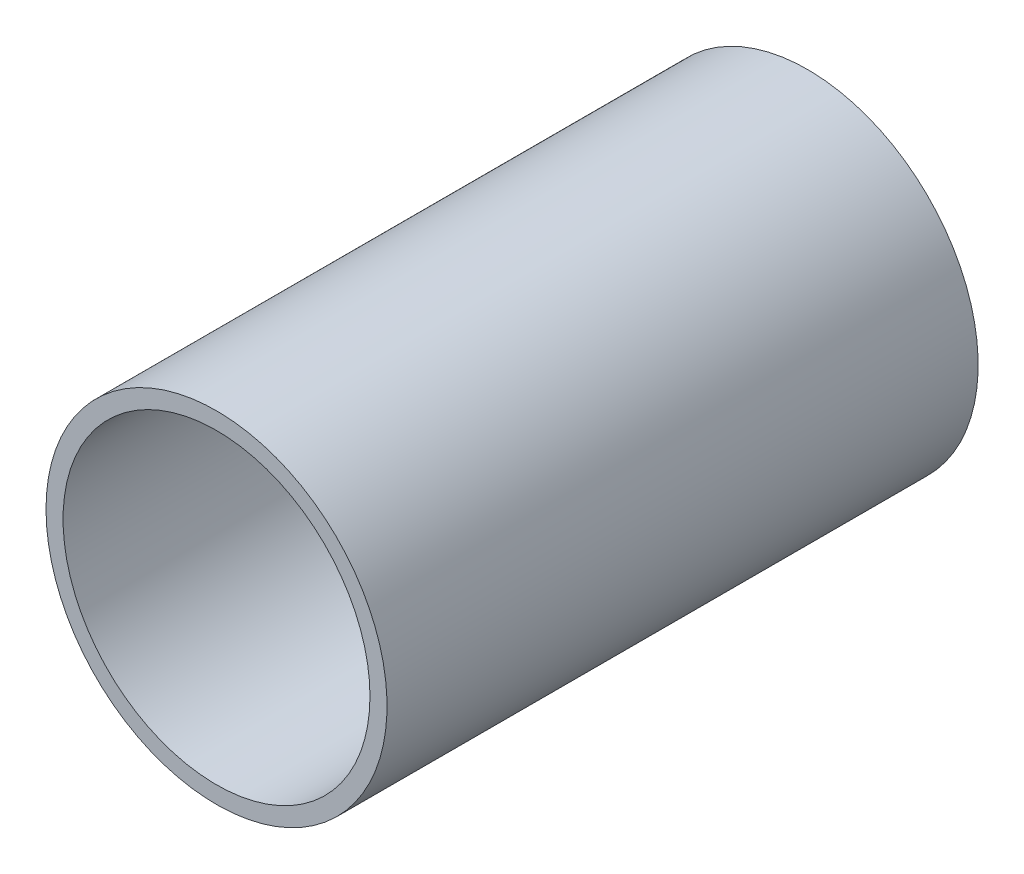
ISO-10303-21;
HEADER;
FILE_DESCRIPTION(('STEP AP214'),'2;1');
FILE_NAME('part.step','',(''),(''),'','','');
FILE_SCHEMA(('AUTOMOTIVE_DESIGN { 1 0 10303 214 1 1 1 1 }'));
ENDSEC;
DATA;
#1=APPLICATION_CONTEXT('core data for automotive mechanical design processes');
#2=APPLICATION_PROTOCOL_DEFINITION('international standard','automotive_design',2000,#1);
#3=PRODUCT_CONTEXT('',#1,'mechanical');
#4=PRODUCT('Part','Part','',(#3));
#5=PRODUCT_RELATED_PRODUCT_CATEGORY('part','',(#4));
#6=PRODUCT_DEFINITION_FORMATION('','',#4);
#7=PRODUCT_DEFINITION_CONTEXT('part definition',#1,'design');
#8=PRODUCT_DEFINITION('design','',#6,#7);
#9=PRODUCT_DEFINITION_SHAPE('','',#8);
#10=(LENGTH_UNIT() NAMED_UNIT(*) SI_UNIT(.MILLI.,.METRE.));
#11=(NAMED_UNIT(*) PLANE_ANGLE_UNIT() SI_UNIT($,.RADIAN.));
#12=(NAMED_UNIT(*) SI_UNIT($,.STERADIAN.) SOLID_ANGLE_UNIT());
#13=UNCERTAINTY_MEASURE_WITH_UNIT(LENGTH_MEASURE(1.E-05),#10,'distance_accuracy_value','');
#14=(GEOMETRIC_REPRESENTATION_CONTEXT(3) GLOBAL_UNCERTAINTY_ASSIGNED_CONTEXT((#13)) GLOBAL_UNIT_ASSIGNED_CONTEXT((#10,
#11,#12)) REPRESENTATION_CONTEXT('',''));
#15=CARTESIAN_POINT('',(0.,0.,0.));
#16=DIRECTION('',(0.,0.,1.));
#17=DIRECTION('',(1.,0.,0.));
#18=AXIS2_PLACEMENT_3D('',#15,#16,#17);
#19=CARTESIAN_POINT('',(0.,0.,52.));
#20=DIRECTION('',(0.,0.,-1.));
#21=DIRECTION('',(-1.,0.,0.));
#22=AXIS2_PLACEMENT_3D('',#19,#20,#21);
#23=CYLINDRICAL_SURFACE('',#22,15.);
#24=CARTESIAN_POINT('',(0.,0.,52.));
#25=DIRECTION('',(0.,0.,1.));
#26=DIRECTION('',(1.,0.,0.));
#27=AXIS2_PLACEMENT_3D('',#24,#25,#26);
#28=CIRCLE('',#27,15.);
#29=CARTESIAN_POINT('',(-15.,0.,52.));
#30=VERTEX_POINT('',#29);
#31=EDGE_CURVE('E10',#30,#30,#28,.T.);
#32=CARTESIAN_POINT('',(0.,0.,0.));
#33=DIRECTION('',(0.,0.,1.));
#34=DIRECTION('',(1.,0.,0.));
#35=AXIS2_PLACEMENT_3D('',#32,#33,#34);
#36=CIRCLE('',#35,15.);
#37=CARTESIAN_POINT('',(-15.,0.,0.));
#38=VERTEX_POINT('',#37);
#39=EDGE_CURVE('E33',#38,#38,#36,.T.);
#40=CARTESIAN_POINT('',(-15.,0.,52.));
#41=CARTESIAN_POINT('',(-15.,0.,51.4583333333333));
#42=CARTESIAN_POINT('',(-15.,0.,50.9166666666667));
#43=CARTESIAN_POINT('',(-15.,0.,49.8333333333333));
#44=CARTESIAN_POINT('',(-15.,0.,49.2916666666667));
#45=CARTESIAN_POINT('',(-15.,0.,48.2083333333333));
#46=CARTESIAN_POINT('',(-15.,0.,47.6666666666667));
#47=CARTESIAN_POINT('',(-15.,0.,46.5833333333333));
#48=CARTESIAN_POINT('',(-15.,0.,46.0416666666667));
#49=CARTESIAN_POINT('',(-15.,0.,44.9583333333333));
#50=CARTESIAN_POINT('',(-15.,0.,44.4166666666667));
#51=CARTESIAN_POINT('',(-15.,0.,43.3333333333333));
#52=CARTESIAN_POINT('',(-15.,0.,42.7916666666667));
#53=CARTESIAN_POINT('',(-15.,0.,41.7083333333333));
#54=CARTESIAN_POINT('',(-15.,0.,41.1666666666667));
#55=CARTESIAN_POINT('',(-15.,0.,40.0833333333333));
#56=CARTESIAN_POINT('',(-15.,0.,39.5416666666667));
#57=CARTESIAN_POINT('',(-15.,0.,38.4583333333333));
#58=CARTESIAN_POINT('',(-15.,0.,37.9166666666667));
#59=CARTESIAN_POINT('',(-15.,0.,36.8333333333333));
#60=CARTESIAN_POINT('',(-15.,0.,36.2916666666667));
#61=CARTESIAN_POINT('',(-15.,0.,35.2083333333333));
#62=CARTESIAN_POINT('',(-15.,0.,34.6666666666667));
#63=CARTESIAN_POINT('',(-15.,0.,33.5833333333333));
#64=CARTESIAN_POINT('',(-15.,0.,33.0416666666667));
#65=CARTESIAN_POINT('',(-15.,0.,31.9583333333333));
#66=CARTESIAN_POINT('',(-15.,0.,31.4166666666667));
#67=CARTESIAN_POINT('',(-15.,0.,30.3333333333333));
#68=CARTESIAN_POINT('',(-15.,0.,29.7916666666667));
#69=CARTESIAN_POINT('',(-15.,0.,28.7083333333333));
#70=CARTESIAN_POINT('',(-15.,0.,28.1666666666667));
#71=CARTESIAN_POINT('',(-15.,0.,27.0833333333333));
#72=CARTESIAN_POINT('',(-15.,0.,26.5416666666667));
#73=CARTESIAN_POINT('',(-15.,0.,25.4583333333333));
#74=CARTESIAN_POINT('',(-15.,0.,24.9166666666667));
#75=CARTESIAN_POINT('',(-15.,0.,23.8333333333333));
#76=CARTESIAN_POINT('',(-15.,0.,23.2916666666667));
#77=CARTESIAN_POINT('',(-15.,0.,22.2083333333333));
#78=CARTESIAN_POINT('',(-15.,0.,21.6666666666667));
#79=CARTESIAN_POINT('',(-15.,0.,20.5833333333333));
#80=CARTESIAN_POINT('',(-15.,0.,20.0416666666667));
#81=CARTESIAN_POINT('',(-15.,0.,18.9583333333333));
#82=CARTESIAN_POINT('',(-15.,0.,18.4166666666667));
#83=CARTESIAN_POINT('',(-15.,0.,17.3333333333333));
#84=CARTESIAN_POINT('',(-15.,0.,16.7916666666667));
#85=CARTESIAN_POINT('',(-15.,0.,15.7083333333333));
#86=CARTESIAN_POINT('',(-15.,0.,15.1666666666667));
#87=CARTESIAN_POINT('',(-15.,0.,14.0833333333333));
#88=CARTESIAN_POINT('',(-15.,0.,13.5416666666667));
#89=CARTESIAN_POINT('',(-15.,0.,12.4583333333333));
#90=CARTESIAN_POINT('',(-15.,0.,11.9166666666667));
#91=CARTESIAN_POINT('',(-15.,0.,10.8333333333333));
#92=CARTESIAN_POINT('',(-15.,0.,10.2916666666667));
#93=CARTESIAN_POINT('',(-15.,0.,9.20833333333333));
#94=CARTESIAN_POINT('',(-15.,0.,8.66666666666667));
#95=CARTESIAN_POINT('',(-15.,0.,7.58333333333333));
#96=CARTESIAN_POINT('',(-15.,0.,7.04166666666667));
#97=CARTESIAN_POINT('',(-15.,0.,5.95833333333333));
#98=CARTESIAN_POINT('',(-15.,0.,5.41666666666667));
#99=CARTESIAN_POINT('',(-15.,0.,4.33333333333333));
#100=CARTESIAN_POINT('',(-15.,0.,3.79166666666667));
#101=CARTESIAN_POINT('',(-15.,0.,2.70833333333334));
#102=CARTESIAN_POINT('',(-15.,0.,2.16666666666667));
#103=CARTESIAN_POINT('',(-15.,0.,1.08333333333333));
#104=CARTESIAN_POINT('',(-15.,0.,0.541666666666667));
#105=CARTESIAN_POINT('',(-15.,0.,0.));
#106=B_SPLINE_CURVE_WITH_KNOTS('',3,(#40,#41,#42,#43,#44,#45,#46,#47,#48,#49,#50,#51,#52,#53,
#54,#55,#56,#57,#58,#59,#60,#61,#62,#63,#64,#65,#66,#67,#68,#69,#70,#71,#72,#73,#74,#75,#76,#77,
#78,#79,#80,#81,#82,#83,#84,#85,#86,#87,#88,#89,#90,#91,#92,#93,#94,#95,#96,#97,#98,#99,#100,
#101,#102,#103,#104,#105),.UNSPECIFIED.,.F.,.F.,(4,2,2,2,2,2,2,2,2,2,2,2,2,2,2,2,2,2,2,2,2,2,2,
2,2,2,2,2,2,2,2,2,4),(0.,1.62499999999999,3.25,4.875,6.49999999999999,8.12499999999999,
9.74999999999999,11.375,13.,14.625,16.25,17.875,19.5,21.125,22.75,24.375,26.,27.625,29.25,
30.875,32.5,34.125,35.75,37.375,39.,40.625,42.25,43.875,45.5,47.125,48.75,50.375,52.),.UNSPECIFIED.);
#107=EDGE_CURVE('BSEAM30',#30,#38,#106,.T.);
#108=ORIENTED_EDGE('',*,*,#31,.F.);
#109=ORIENTED_EDGE('',*,*,#39,.T.);
#110=ORIENTED_EDGE('',*,*,#107,.T.);
#111=ORIENTED_EDGE('',*,*,#107,.F.);
#112=EDGE_LOOP('',(#108,#110,#109,#111));
#113=FACE_BOUND('',#112,.T.);
#114=ADVANCED_FACE('F30',(#113),#23,.T.);
#115=CARTESIAN_POINT('',(0.,0.,52.));
#116=DIRECTION('',(0.,0.,1.));
#117=DIRECTION('',(1.,0.,0.));
#118=AXIS2_PLACEMENT_3D('',#115,#116,#117);
#119=PLANE('',#118);
#120=CARTESIAN_POINT('',(0.,0.,52.));
#121=DIRECTION('',(0.,0.,1.));
#122=DIRECTION('',(1.,0.,0.));
#123=AXIS2_PLACEMENT_3D('',#120,#121,#122);
#124=CIRCLE('',#123,13.5);
#125=CARTESIAN_POINT('',(13.5,0.,52.));
#126=VERTEX_POINT('',#125);
#127=EDGE_CURVE('E42',#126,#126,#124,.T.);
#128=ORIENTED_EDGE('',*,*,#127,.F.);
#129=EDGE_LOOP('',(#128));
#130=FACE_BOUND('',#129,.T.);
#131=ORIENTED_EDGE('',*,*,#31,.T.);
#132=EDGE_LOOP('',(#131));
#133=FACE_BOUND('',#132,.T.);
#134=ADVANCED_FACE('F57',(#130,#133),#119,.T.);
#135=CARTESIAN_POINT('',(0.,0.,0.));
#136=DIRECTION('',(0.,0.,1.));
#137=DIRECTION('',(1.,0.,0.));
#138=AXIS2_PLACEMENT_3D('',#135,#136,#137);
#139=PLANE('',#138);
#140=ORIENTED_EDGE('',*,*,#39,.F.);
#141=EDGE_LOOP('',(#140));
#142=FACE_BOUND('',#141,.T.);
#143=ADVANCED_FACE('F53',(#142),#139,.F.);
#144=CARTESIAN_POINT('',(0.,0.,4.));
#145=DIRECTION('',(0.,0.,1.));
#146=DIRECTION('',(1.,0.,0.));
#147=AXIS2_PLACEMENT_3D('',#144,#145,#146);
#148=CYLINDRICAL_SURFACE('',#147,13.5);
#149=CARTESIAN_POINT('',(0.,0.,4.));
#150=DIRECTION('',(0.,0.,1.));
#151=DIRECTION('',(1.,0.,0.));
#152=AXIS2_PLACEMENT_3D('',#149,#150,#151);
#153=CIRCLE('',#152,13.5);
#154=CARTESIAN_POINT('',(13.5,0.,4.));
#155=VERTEX_POINT('',#154);
#156=EDGE_CURVE('E40',#155,#155,#153,.T.);
#157=ORIENTED_EDGE('',*,*,#156,.F.);
#158=EDGE_LOOP('',(#157));
#159=FACE_BOUND('',#158,.T.);
#160=ORIENTED_EDGE('',*,*,#127,.T.);
#161=EDGE_LOOP('',(#160));
#162=FACE_BOUND('',#161,.T.);
#163=ADVANCED_FACE('F50',(#159,#162),#148,.F.);
#164=CARTESIAN_POINT('',(0.,0.,4.));
#165=DIRECTION('',(0.,0.,1.));
#166=DIRECTION('',(1.,0.,0.));
#167=AXIS2_PLACEMENT_3D('',#164,#165,#166);
#168=PLANE('',#167);
#169=ORIENTED_EDGE('',*,*,#156,.T.);
#170=EDGE_LOOP('',(#169));
#171=FACE_BOUND('',#170,.T.);
#172=ADVANCED_FACE('F48',(#171),#168,.T.);
#173=CLOSED_SHELL('',(#114,#134,#143,#163,#172));
#174=MANIFOLD_SOLID_BREP('B2',#173);
#175=ADVANCED_BREP_SHAPE_REPRESENTATION('',(#18,#174),#14);
#176=SHAPE_DEFINITION_REPRESENTATION(#9,#175);
ENDSEC;
END-ISO-10303-21;
